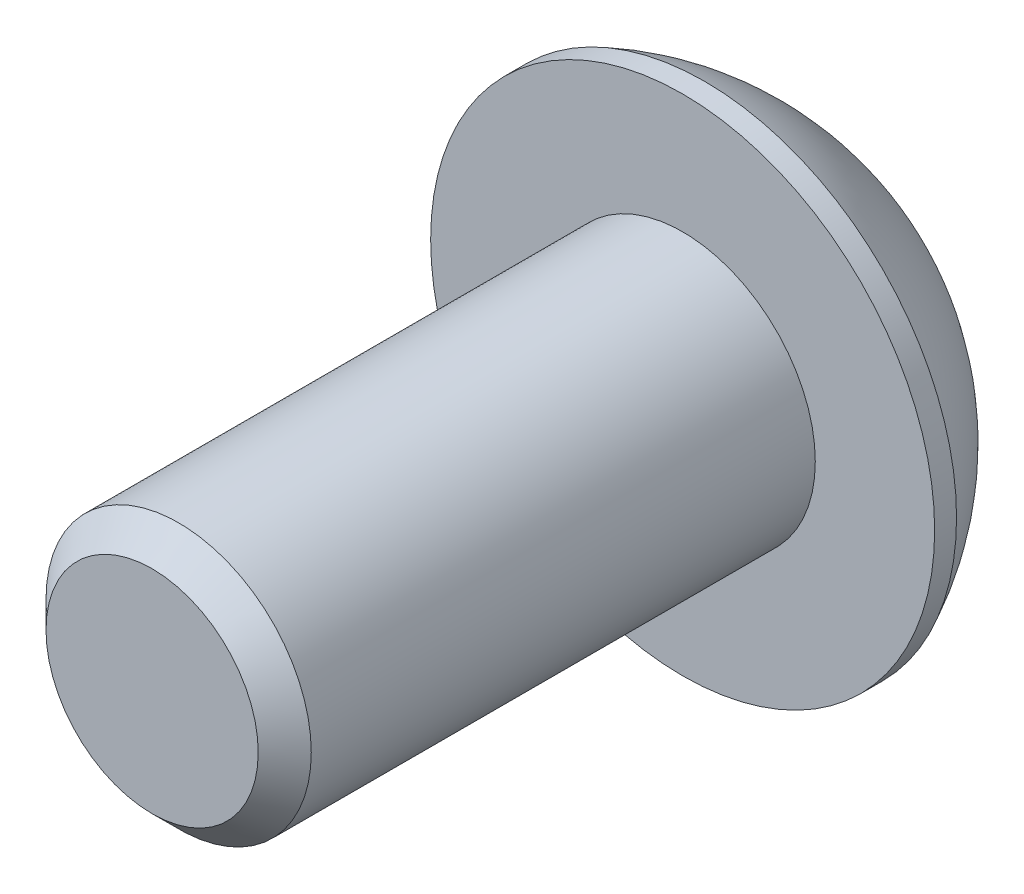
ISO-10303-21;
HEADER;
FILE_DESCRIPTION(('STEP AP214'),'2;1');
FILE_NAME('part.step','',(''),(''),'','','');
FILE_SCHEMA(('AUTOMOTIVE_DESIGN { 1 0 10303 214 1 1 1 1 }'));
ENDSEC;
DATA;
#1=APPLICATION_CONTEXT('core data for automotive mechanical design processes');
#2=APPLICATION_PROTOCOL_DEFINITION('international standard','automotive_design',2000,#1);
#3=PRODUCT_CONTEXT('',#1,'mechanical');
#4=PRODUCT('Part','Part','',(#3));
#5=PRODUCT_RELATED_PRODUCT_CATEGORY('part','',(#4));
#6=PRODUCT_DEFINITION_FORMATION('','',#4);
#7=PRODUCT_DEFINITION_CONTEXT('part definition',#1,'design');
#8=PRODUCT_DEFINITION('design','',#6,#7);
#9=PRODUCT_DEFINITION_SHAPE('','',#8);
#10=(LENGTH_UNIT() NAMED_UNIT(*) SI_UNIT(.MILLI.,.METRE.));
#11=(NAMED_UNIT(*) PLANE_ANGLE_UNIT() SI_UNIT($,.RADIAN.));
#12=(NAMED_UNIT(*) SI_UNIT($,.STERADIAN.) SOLID_ANGLE_UNIT());
#13=UNCERTAINTY_MEASURE_WITH_UNIT(LENGTH_MEASURE(1.E-05),#10,'distance_accuracy_value','');
#14=(GEOMETRIC_REPRESENTATION_CONTEXT(3) GLOBAL_UNCERTAINTY_ASSIGNED_CONTEXT((#13)) GLOBAL_UNIT_ASSIGNED_CONTEXT((#10,
#11,#12)) REPRESENTATION_CONTEXT('',''));
#15=CARTESIAN_POINT('',(0.,0.,0.));
#16=DIRECTION('',(0.,0.,1.));
#17=DIRECTION('',(1.,0.,0.));
#18=AXIS2_PLACEMENT_3D('',#15,#16,#17);
#19=CARTESIAN_POINT('',(0.,-1.15470053837925,1.155));
#20=DIRECTION('',(-0.5,-0.866025403784439,0.));
#21=DIRECTION('',(-0.866025403784439,0.5,0.));
#22=AXIS2_PLACEMENT_3D('',#19,#20,#21);
#23=PLANE('',#22);
#24=DIRECTION('',(0.,0.,-1.));
#25=VECTOR('',#24,1.);
#26=CARTESIAN_POINT('',(0.,-1.15470053837925,1.155));
#27=LINE('',#26,#25);
#28=CARTESIAN_POINT('',(0.,-1.15470053837925,1.155));
#29=VERTEX_POINT('',#28);
#30=CARTESIAN_POINT('',(0.,-1.15470053837925,0.));
#31=VERTEX_POINT('',#30);
#32=EDGE_CURVE('E11',#29,#31,#27,.T.);
#33=ORIENTED_EDGE('',*,*,#32,.T.);
#34=CARTESIAN_POINT('',(0.,-1.15470053837922,0.));
#35=CARTESIAN_POINT('',(-0.500000000000002,-0.866025403784439,0.288675134594791));
#36=CARTESIAN_POINT('',(-0.999999999999949,-0.577350269189654,0.));
#37=(BOUNDED_CURVE() B_SPLINE_CURVE(2,(#34,#35,#36),.UNSPECIFIED.,.F.,
.F.) B_SPLINE_CURVE_WITH_KNOTS((3,3),(-0.321867155116299,-0.124274873543865),
.UNSPECIFIED.) CURVE() GEOMETRIC_REPRESENTATION_ITEM() RATIONAL_B_SPLINE_CURVE((1.46410161513778,
1.69059892324148,1.46410161513778)) REPRESENTATION_ITEM(''));
#38=CARTESIAN_POINT('',(-1.,-0.577350269189626,0.));
#39=VERTEX_POINT('',#38);
#40=EDGE_CURVE('E231',#31,#39,#37,.T.);
#41=ORIENTED_EDGE('',*,*,#40,.T.);
#42=DIRECTION('',(0.,0.,-1.));
#43=VECTOR('',#42,1.);
#44=CARTESIAN_POINT('',(-1.,-0.577350269189626,1.155));
#45=LINE('',#44,#43);
#46=CARTESIAN_POINT('',(-1.,-0.577350269189626,1.155));
#47=VERTEX_POINT('',#46);
#48=EDGE_CURVE('E143',#47,#39,#45,.T.);
#49=ORIENTED_EDGE('',*,*,#48,.F.);
#50=DIRECTION('',(-0.866025403784439,0.5,0.));
#51=VECTOR('',#50,1.);
#52=CARTESIAN_POINT('',(0.,-1.15470053837925,1.155));
#53=LINE('',#52,#51);
#54=EDGE_CURVE('E200',#29,#47,#53,.T.);
#55=ORIENTED_EDGE('',*,*,#54,.F.);
#56=EDGE_LOOP('',(#33,#41,#49,#55));
#57=FACE_BOUND('',#56,.T.);
#58=ADVANCED_FACE('F17',(#57),#23,.F.);
#59=CARTESIAN_POINT('',(1.,-0.577350269189626,1.155));
#60=DIRECTION('',(0.5,-0.866025403784439,0.));
#61=DIRECTION('',(0.,0.,-1.));
#62=AXIS2_PLACEMENT_3D('',#59,#60,#61);
#63=PLANE('',#62);
#64=DIRECTION('',(0.,0.,-1.));
#65=VECTOR('',#64,1.);
#66=CARTESIAN_POINT('',(1.,-0.577350269189626,1.155));
#67=LINE('',#66,#65);
#68=CARTESIAN_POINT('',(1.,-0.577350269189626,1.155));
#69=VERTEX_POINT('',#68);
#70=CARTESIAN_POINT('',(1.,-0.577350269189626,0.));
#71=VERTEX_POINT('',#70);
#72=EDGE_CURVE('E25',#69,#71,#67,.T.);
#73=ORIENTED_EDGE('',*,*,#72,.T.);
#74=CARTESIAN_POINT('',(0.999999999999948,-0.577350269189655,0.));
#75=CARTESIAN_POINT('',(0.5,-0.866025403784439,0.288675134594789));
#76=CARTESIAN_POINT('',(0.,-1.15470053837922,0.));
#77=(BOUNDED_CURVE() B_SPLINE_CURVE(2,(#74,#75,#76),.UNSPECIFIED.,.F.,
.F.) B_SPLINE_CURVE_WITH_KNOTS((3,3),(-0.321867155116299,-0.124274873543865),
.UNSPECIFIED.) CURVE() GEOMETRIC_REPRESENTATION_ITEM() RATIONAL_B_SPLINE_CURVE((1.46410161513778,
1.69059892324148,1.46410161513778)) REPRESENTATION_ITEM(''));
#78=EDGE_CURVE('E222',#71,#31,#77,.T.);
#79=ORIENTED_EDGE('',*,*,#78,.T.);
#80=ORIENTED_EDGE('',*,*,#32,.F.);
#81=DIRECTION('',(-0.866025403784439,-0.5,0.));
#82=VECTOR('',#81,1.);
#83=CARTESIAN_POINT('',(1.,-0.577350269189626,1.155));
#84=LINE('',#83,#82);
#85=EDGE_CURVE('E146',#69,#29,#84,.T.);
#86=ORIENTED_EDGE('',*,*,#85,.F.);
#87=EDGE_LOOP('',(#73,#79,#80,#86));
#88=FACE_BOUND('',#87,.T.);
#89=ADVANCED_FACE('F263',(#88),#63,.F.);
#90=CARTESIAN_POINT('',(1.,0.577350269189626,1.155));
#91=DIRECTION('',(1.,0.,0.));
#92=DIRECTION('',(0.,0.,1.));
#93=AXIS2_PLACEMENT_3D('',#90,#91,#92);
#94=PLANE('',#93);
#95=DIRECTION('',(0.,0.,-1.));
#96=VECTOR('',#95,1.);
#97=CARTESIAN_POINT('',(1.,0.577350269189626,1.155));
#98=LINE('',#97,#96);
#99=CARTESIAN_POINT('',(1.,0.577350269189626,1.155));
#100=VERTEX_POINT('',#99);
#101=CARTESIAN_POINT('',(1.,0.577350269189626,0.));
#102=VERTEX_POINT('',#101);
#103=EDGE_CURVE('E46',#100,#102,#98,.T.);
#104=ORIENTED_EDGE('',*,*,#103,.T.);
#105=CARTESIAN_POINT('',(1.,0.577350269189569,0.));
#106=CARTESIAN_POINT('',(1.,0.,0.288675134594791));
#107=CARTESIAN_POINT('',(1.,-0.577350269189568,0.));
#108=(BOUNDED_CURVE() B_SPLINE_CURVE(2,(#105,#106,#107),.UNSPECIFIED.,.F.,
.F.) B_SPLINE_CURVE_WITH_KNOTS((3,3),(-0.3218671551163,-0.124274873543865),
.UNSPECIFIED.) CURVE() GEOMETRIC_REPRESENTATION_ITEM() RATIONAL_B_SPLINE_CURVE((1.46410161513777,
1.69059892324148,1.46410161513777)) REPRESENTATION_ITEM(''));
#109=EDGE_CURVE('E214',#102,#71,#108,.T.);
#110=ORIENTED_EDGE('',*,*,#109,.T.);
#111=ORIENTED_EDGE('',*,*,#72,.F.);
#112=DIRECTION('',(0.,-1.,0.));
#113=VECTOR('',#112,1.);
#114=CARTESIAN_POINT('',(1.,0.577350269189626,1.155));
#115=LINE('',#114,#113);
#116=EDGE_CURVE('E191',#100,#69,#115,.T.);
#117=ORIENTED_EDGE('',*,*,#116,.F.);
#118=EDGE_LOOP('',(#104,#110,#111,#117));
#119=FACE_BOUND('',#118,.T.);
#120=ADVANCED_FACE('F269',(#119),#94,.F.);
#121=CARTESIAN_POINT('',(0.,1.15470053837925,1.155));
#122=DIRECTION('',(0.5,0.866025403784439,0.));
#123=DIRECTION('',(0.,0.,-1.));
#124=AXIS2_PLACEMENT_3D('',#121,#122,#123);
#125=PLANE('',#124);
#126=DIRECTION('',(0.,0.,-1.));
#127=VECTOR('',#126,1.);
#128=CARTESIAN_POINT('',(0.,1.15470053837925,1.155));
#129=LINE('',#128,#127);
#130=CARTESIAN_POINT('',(0.,1.15470053837925,1.155));
#131=VERTEX_POINT('',#130);
#132=CARTESIAN_POINT('',(0.,1.15470053837925,0.));
#133=VERTEX_POINT('',#132);
#134=EDGE_CURVE('E166',#131,#133,#129,.T.);
#135=ORIENTED_EDGE('',*,*,#134,.T.);
#136=CARTESIAN_POINT('',(0.,1.15470053837922,0.));
#137=CARTESIAN_POINT('',(0.5,0.866025403784439,0.288675134594791));
#138=CARTESIAN_POINT('',(0.999999999999951,0.577350269189654,0.));
#139=(BOUNDED_CURVE() B_SPLINE_CURVE(2,(#136,#137,#138),.UNSPECIFIED.,.F.,
.F.) B_SPLINE_CURVE_WITH_KNOTS((3,3),(-0.3218671551163,-0.124274873543865),
.UNSPECIFIED.) CURVE() GEOMETRIC_REPRESENTATION_ITEM() RATIONAL_B_SPLINE_CURVE((1.46410161513778,
1.69059892324148,1.46410161513778)) REPRESENTATION_ITEM(''));
#140=EDGE_CURVE('E206',#133,#102,#139,.T.);
#141=ORIENTED_EDGE('',*,*,#140,.T.);
#142=ORIENTED_EDGE('',*,*,#103,.F.);
#143=DIRECTION('',(0.866025403784439,-0.5,0.));
#144=VECTOR('',#143,1.);
#145=CARTESIAN_POINT('',(0.,1.15470053837925,1.155));
#146=LINE('',#145,#144);
#147=EDGE_CURVE('E249',#131,#100,#146,.T.);
#148=ORIENTED_EDGE('',*,*,#147,.F.);
#149=EDGE_LOOP('',(#135,#141,#142,#148));
#150=FACE_BOUND('',#149,.T.);
#151=ADVANCED_FACE('F310',(#150),#125,.F.);
#152=CARTESIAN_POINT('',(-1.,0.577350269189626,1.155));
#153=DIRECTION('',(-0.5,0.866025403784439,0.));
#154=DIRECTION('',(0.,0.,1.));
#155=AXIS2_PLACEMENT_3D('',#152,#153,#154);
#156=PLANE('',#155);
#157=DIRECTION('',(0.,0.,-1.));
#158=VECTOR('',#157,1.);
#159=CARTESIAN_POINT('',(-1.,0.577350269189626,1.155));
#160=LINE('',#159,#158);
#161=CARTESIAN_POINT('',(-1.,0.577350269189626,1.155));
#162=VERTEX_POINT('',#161);
#163=CARTESIAN_POINT('',(-1.,0.577350269189626,0.));
#164=VERTEX_POINT('',#163);
#165=EDGE_CURVE('E145',#162,#164,#160,.T.);
#166=ORIENTED_EDGE('',*,*,#165,.T.);
#167=CARTESIAN_POINT('',(-0.999999999999952,0.577350269189653,0.));
#168=CARTESIAN_POINT('',(-0.5,0.866025403784439,0.288675134594791));
#169=CARTESIAN_POINT('',(0.,1.15470053837922,0.));
#170=(BOUNDED_CURVE() B_SPLINE_CURVE(2,(#167,#168,#169),.UNSPECIFIED.,.F.,
.F.) B_SPLINE_CURVE_WITH_KNOTS((3,3),(-0.3218671551163,-0.124274873543865),
.UNSPECIFIED.) CURVE() GEOMETRIC_REPRESENTATION_ITEM() RATIONAL_B_SPLINE_CURVE((1.46410161513778,
1.69059892324148,1.46410161513778)) REPRESENTATION_ITEM(''));
#171=EDGE_CURVE('E152',#164,#133,#170,.T.);
#172=ORIENTED_EDGE('',*,*,#171,.T.);
#173=ORIENTED_EDGE('',*,*,#134,.F.);
#174=DIRECTION('',(0.866025403784439,0.5,0.));
#175=VECTOR('',#174,1.);
#176=CARTESIAN_POINT('',(-1.,0.577350269189626,1.155));
#177=LINE('',#176,#175);
#178=EDGE_CURVE('E199',#162,#131,#177,.T.);
#179=ORIENTED_EDGE('',*,*,#178,.F.);
#180=EDGE_LOOP('',(#166,#172,#173,#179));
#181=FACE_BOUND('',#180,.T.);
#182=ADVANCED_FACE('F315',(#181),#156,.F.);
#183=CARTESIAN_POINT('',(-1.,-0.577350269189626,1.155));
#184=DIRECTION('',(-1.,0.,0.));
#185=DIRECTION('',(0.,0.,1.));
#186=AXIS2_PLACEMENT_3D('',#183,#184,#185);
#187=PLANE('',#186);
#188=ORIENTED_EDGE('',*,*,#48,.T.);
#189=CARTESIAN_POINT('',(-1.,-0.577350269189568,0.));
#190=CARTESIAN_POINT('',(-1.,0.,0.288675134594789));
#191=CARTESIAN_POINT('',(-1.,0.577350269189568,0.));
#192=(BOUNDED_CURVE() B_SPLINE_CURVE(2,(#189,#190,#191),.UNSPECIFIED.,.F.,
.F.) B_SPLINE_CURVE_WITH_KNOTS((3,3),(-0.321867155116299,-0.124274873543865),
.UNSPECIFIED.) CURVE() GEOMETRIC_REPRESENTATION_ITEM() RATIONAL_B_SPLINE_CURVE((1.46410161513777,
1.69059892324148,1.46410161513777)) REPRESENTATION_ITEM(''));
#193=EDGE_CURVE('E142',#39,#164,#192,.T.);
#194=ORIENTED_EDGE('',*,*,#193,.T.);
#195=ORIENTED_EDGE('',*,*,#165,.F.);
#196=DIRECTION('',(0.,1.,0.));
#197=VECTOR('',#196,1.);
#198=CARTESIAN_POINT('',(-1.,-0.577350269189626,1.155));
#199=LINE('',#198,#197);
#200=EDGE_CURVE('E195',#47,#162,#199,.T.);
#201=ORIENTED_EDGE('',*,*,#200,.F.);
#202=EDGE_LOOP('',(#188,#194,#195,#201));
#203=FACE_BOUND('',#202,.T.);
#204=ADVANCED_FACE('F305',(#203),#187,.F.);
#205=CARTESIAN_POINT('',(-1.,-0.577350269189625,1.155));
#206=DIRECTION('',(0.,0.,-1.));
#207=DIRECTION('',(0.,-1.,0.));
#208=AXIS2_PLACEMENT_3D('',#205,#206,#207);
#209=PLANE('',#208);
#210=ORIENTED_EDGE('',*,*,#54,.T.);
#211=ORIENTED_EDGE('',*,*,#200,.T.);
#212=ORIENTED_EDGE('',*,*,#178,.T.);
#213=ORIENTED_EDGE('',*,*,#147,.T.);
#214=ORIENTED_EDGE('',*,*,#116,.T.);
#215=ORIENTED_EDGE('',*,*,#85,.T.);
#216=EDGE_LOOP('',(#210,#211,#212,#213,#214,#215));
#217=FACE_BOUND('',#216,.T.);
#218=ADVANCED_FACE('F309',(#217),#209,.T.);
#219=CARTESIAN_POINT('',(0.,0.,0.));
#220=DIRECTION('',(0.,0.,-1.));
#221=DIRECTION('',(-1.,0.,0.));
#222=AXIS2_PLACEMENT_3D('',#219,#220,#221);
#223=CONICAL_SURFACE('',#222,1.15470053837925,0.78539816339745);
#224=CARTESIAN_POINT('',(0.,0.,0.));
#225=DIRECTION('',(0.,0.,-1.));
#226=DIRECTION('',(-1.,0.,0.));
#227=AXIS2_PLACEMENT_3D('',#224,#225,#226);
#228=CIRCLE('',#227,1.15470053837925);
#229=EDGE_CURVE('E153',#31,#39,#228,.T.);
#230=ORIENTED_EDGE('',*,*,#229,.T.);
#231=ORIENTED_EDGE('',*,*,#40,.F.);
#232=EDGE_LOOP('',(#230,#231));
#233=FACE_BOUND('',#232,.T.);
#234=ADVANCED_FACE('F289',(#233),#223,.F.);
#235=CARTESIAN_POINT('',(0.,0.,0.));
#236=DIRECTION('',(0.,0.,-1.));
#237=DIRECTION('',(-1.,0.,0.));
#238=AXIS2_PLACEMENT_3D('',#235,#236,#237);
#239=CONICAL_SURFACE('',#238,1.15470053837925,0.78539816339745);
#240=CARTESIAN_POINT('',(0.,0.,0.));
#241=DIRECTION('',(0.,0.,-1.));
#242=DIRECTION('',(-1.,0.,0.));
#243=AXIS2_PLACEMENT_3D('',#240,#241,#242);
#244=CIRCLE('',#243,1.15470053837925);
#245=EDGE_CURVE('E148',#71,#31,#244,.T.);
#246=ORIENTED_EDGE('',*,*,#245,.T.);
#247=ORIENTED_EDGE('',*,*,#78,.F.);
#248=EDGE_LOOP('',(#246,#247));
#249=FACE_BOUND('',#248,.T.);
#250=ADVANCED_FACE('F265',(#249),#239,.F.);
#251=CARTESIAN_POINT('',(0.,0.,0.));
#252=DIRECTION('',(0.,0.,-1.));
#253=DIRECTION('',(1.,0.,0.));
#254=AXIS2_PLACEMENT_3D('',#251,#252,#253);
#255=CONICAL_SURFACE('',#254,1.15470053837925,0.78539816339745);
#256=CARTESIAN_POINT('',(0.,0.,0.));
#257=DIRECTION('',(0.,0.,-1.));
#258=DIRECTION('',(-1.,0.,0.));
#259=AXIS2_PLACEMENT_3D('',#256,#257,#258);
#260=CIRCLE('',#259,1.15470053837925);
#261=EDGE_CURVE('E184',#102,#71,#260,.T.);
#262=ORIENTED_EDGE('',*,*,#261,.T.);
#263=ORIENTED_EDGE('',*,*,#109,.F.);
#264=EDGE_LOOP('',(#262,#263));
#265=FACE_BOUND('',#264,.T.);
#266=ADVANCED_FACE('F277',(#265),#255,.F.);
#267=CARTESIAN_POINT('',(0.,0.,0.));
#268=DIRECTION('',(0.,0.,-1.));
#269=DIRECTION('',(-1.,0.,0.));
#270=AXIS2_PLACEMENT_3D('',#267,#268,#269);
#271=CONICAL_SURFACE('',#270,1.15470053837925,0.78539816339745);
#272=CARTESIAN_POINT('',(0.,0.,0.));
#273=DIRECTION('',(0.,0.,-1.));
#274=DIRECTION('',(-1.,0.,0.));
#275=AXIS2_PLACEMENT_3D('',#272,#273,#274);
#276=CIRCLE('',#275,1.15470053837925);
#277=EDGE_CURVE('E135',#133,#102,#276,.T.);
#278=ORIENTED_EDGE('',*,*,#277,.T.);
#279=ORIENTED_EDGE('',*,*,#140,.F.);
#280=EDGE_LOOP('',(#278,#279));
#281=FACE_BOUND('',#280,.T.);
#282=ADVANCED_FACE('F279',(#281),#271,.F.);
#283=CARTESIAN_POINT('',(0.,0.,0.));
#284=DIRECTION('',(0.,0.,-1.));
#285=DIRECTION('',(-1.,0.,0.));
#286=AXIS2_PLACEMENT_3D('',#283,#284,#285);
#287=CONICAL_SURFACE('',#286,1.15470053837925,0.78539816339745);
#288=CARTESIAN_POINT('',(0.,0.,0.));
#289=DIRECTION('',(0.,0.,-1.));
#290=DIRECTION('',(-1.,0.,0.));
#291=AXIS2_PLACEMENT_3D('',#288,#289,#290);
#292=CIRCLE('',#291,1.15470053837925);
#293=EDGE_CURVE('E181',#164,#133,#292,.T.);
#294=ORIENTED_EDGE('',*,*,#293,.T.);
#295=ORIENTED_EDGE('',*,*,#171,.F.);
#296=EDGE_LOOP('',(#294,#295));
#297=FACE_BOUND('',#296,.T.);
#298=ADVANCED_FACE('F286',(#297),#287,.F.);
#299=CARTESIAN_POINT('',(0.,-2.85,1.65));
#300=DIRECTION('',(0.,0.,-1.));
#301=DIRECTION('',(0.,-1.,0.));
#302=AXIS2_PLACEMENT_3D('',#299,#300,#301);
#303=PLANE('',#302);
#304=CARTESIAN_POINT('',(0.,0.,1.65));
#305=DIRECTION('',(0.,0.,-1.));
#306=DIRECTION('',(-1.,0.,0.));
#307=AXIS2_PLACEMENT_3D('',#304,#305,#306);
#308=CIRCLE('',#307,1.5);
#309=CARTESIAN_POINT('',(1.5,0.,1.65));
#310=VERTEX_POINT('',#309);
#311=EDGE_CURVE('E117',#310,#310,#308,.T.);
#312=ORIENTED_EDGE('',*,*,#311,.T.);
#313=EDGE_LOOP('',(#312));
#314=FACE_BOUND('',#313,.T.);
#315=CARTESIAN_POINT('',(0.,0.,1.65));
#316=DIRECTION('',(0.,0.,-1.));
#317=DIRECTION('',(-1.,0.,0.));
#318=AXIS2_PLACEMENT_3D('',#315,#316,#317);
#319=CIRCLE('',#318,2.85);
#320=CARTESIAN_POINT('',(2.85,0.,1.65));
#321=VERTEX_POINT('',#320);
#322=EDGE_CURVE('E156',#321,#321,#319,.T.);
#323=ORIENTED_EDGE('',*,*,#322,.F.);
#324=EDGE_LOOP('',(#323));
#325=FACE_BOUND('',#324,.T.);
#326=ADVANCED_FACE('F322',(#314,#325),#303,.F.);
#327=CARTESIAN_POINT('',(0.,-1.5,0.));
#328=DIRECTION('',(0.,0.,1.));
#329=DIRECTION('',(1.,0.,0.));
#330=AXIS2_PLACEMENT_3D('',#327,#328,#329);
#331=PLANE('',#330);
#332=ORIENTED_EDGE('',*,*,#261,.F.);
#333=ORIENTED_EDGE('',*,*,#277,.F.);
#334=ORIENTED_EDGE('',*,*,#293,.F.);
#335=CARTESIAN_POINT('',(0.,0.,0.));
#336=DIRECTION('',(0.,0.,-1.));
#337=DIRECTION('',(-1.,0.,0.));
#338=AXIS2_PLACEMENT_3D('',#335,#336,#337);
#339=CIRCLE('',#338,1.15470053837925);
#340=EDGE_CURVE('E137',#39,#164,#339,.T.);
#341=ORIENTED_EDGE('',*,*,#340,.F.);
#342=ORIENTED_EDGE('',*,*,#229,.F.);
#343=ORIENTED_EDGE('',*,*,#245,.F.);
#344=EDGE_LOOP('',(#332,#333,#334,#341,#342,#343));
#345=FACE_BOUND('',#344,.T.);
#346=CARTESIAN_POINT('',(0.,0.,0.));
#347=DIRECTION('',(0.,0.,-1.));
#348=DIRECTION('',(-1.,0.,0.));
#349=AXIS2_PLACEMENT_3D('',#346,#347,#348);
#350=CIRCLE('',#349,1.5);
#351=CARTESIAN_POINT('',(0.,-1.5,0.));
#352=VERTEX_POINT('',#351);
#353=EDGE_CURVE('E159',#352,#352,#350,.T.);
#354=ORIENTED_EDGE('',*,*,#353,.T.);
#355=EDGE_LOOP('',(#354));
#356=FACE_BOUND('',#355,.T.);
#357=ADVANCED_FACE('F273',(#345,#356),#331,.F.);
#358=CARTESIAN_POINT('',(0.,0.,2.79483288770053));
#359=DIRECTION('',(-1.,0.,0.));
#360=DIRECTION('',(0.,-1.,0.));
#361=AXIS2_PLACEMENT_3D('',#358,#359,#360);
#362=SPHERICAL_SURFACE('',#361,3.17192226735973);
#363=CARTESIAN_POINT('',(0.,0.,2.79483288770053));
#364=DIRECTION('',(0.,0.,-1.));
#365=DIRECTION('',(-1.,0.,0.));
#366=AXIS2_PLACEMENT_3D('',#363,#364,#365);
#367=SPHERICAL_SURFACE('',#366,3.17192226735973);
#368=ORIENTED_EDGE('',*,*,#353,.F.);
#369=EDGE_LOOP('',(#368));
#370=FACE_BOUND('',#369,.T.);
#371=CARTESIAN_POINT('',(0.,0.,1.4025));
#372=DIRECTION('',(0.,0.,-1.));
#373=DIRECTION('',(-1.,0.,0.));
#374=AXIS2_PLACEMENT_3D('',#371,#372,#373);
#375=CIRCLE('',#374,2.85);
#376=CARTESIAN_POINT('',(2.85,0.,1.4025));
#377=VERTEX_POINT('',#376);
#378=EDGE_CURVE('E141',#377,#377,#375,.T.);
#379=ORIENTED_EDGE('',*,*,#378,.T.);
#380=EDGE_LOOP('',(#379));
#381=FACE_BOUND('',#380,.T.);
#382=ADVANCED_FACE('F330',(#370,#381),#367,.T.);
#383=CARTESIAN_POINT('',(0.,0.,0.));
#384=DIRECTION('',(0.,0.,-1.));
#385=DIRECTION('',(-1.,0.,0.));
#386=AXIS2_PLACEMENT_3D('',#383,#384,#385);
#387=CYLINDRICAL_SURFACE('',#386,2.85);
#388=ORIENTED_EDGE('',*,*,#378,.F.);
#389=DIRECTION('',(0.,0.,1.));
#390=VECTOR('',#389,1.);
#391=CARTESIAN_POINT('',(2.85,0.,0.));
#392=LINE('',#391,#390);
#393=EDGE_CURVE('E160',#377,#321,#392,.T.);
#394=ORIENTED_EDGE('',*,*,#393,.T.);
#395=ORIENTED_EDGE('',*,*,#322,.T.);
#396=ORIENTED_EDGE('',*,*,#393,.F.);
#397=EDGE_LOOP('',(#388,#394,#395,#396));
#398=FACE_BOUND('',#397,.T.);
#399=ADVANCED_FACE('F332',(#398),#387,.T.);
#400=CARTESIAN_POINT('',(0.,0.,0.));
#401=DIRECTION('',(0.,0.,-1.));
#402=DIRECTION('',(-1.,0.,0.));
#403=AXIS2_PLACEMENT_3D('',#400,#401,#402);
#404=CONICAL_SURFACE('',#403,1.15470053837925,0.78539816339745);
#405=ORIENTED_EDGE('',*,*,#193,.F.);
#406=ORIENTED_EDGE('',*,*,#340,.T.);
#407=EDGE_LOOP('',(#405,#406));
#408=FACE_BOUND('',#407,.T.);
#409=ADVANCED_FACE('F303',(#408),#404,.F.);
#410=CARTESIAN_POINT('',(0.,0.,7.65));
#411=DIRECTION('',(0.,0.,1.));
#412=DIRECTION('',(1.,0.,0.));
#413=AXIS2_PLACEMENT_3D('',#410,#411,#412);
#414=PLANE('',#413);
#415=CARTESIAN_POINT('',(0.,0.,7.65));
#416=DIRECTION('',(0.,0.,-1.));
#417=DIRECTION('',(-1.,0.,0.));
#418=AXIS2_PLACEMENT_3D('',#415,#416,#417);
#419=CIRCLE('',#418,1.2);
#420=CARTESIAN_POINT('',(1.2,0.,7.65));
#421=VERTEX_POINT('',#420);
#422=EDGE_CURVE('E119',#421,#421,#419,.T.);
#423=ORIENTED_EDGE('',*,*,#422,.F.);
#424=EDGE_LOOP('',(#423));
#425=FACE_BOUND('',#424,.T.);
#426=ADVANCED_FACE('F337',(#425),#414,.T.);
#427=CARTESIAN_POINT('',(0.,0.,1.65));
#428=DIRECTION('',(0.,0.,1.));
#429=DIRECTION('',(-1.,0.,0.));
#430=AXIS2_PLACEMENT_3D('',#427,#428,#429);
#431=CYLINDRICAL_SURFACE('',#430,1.5);
#432=CARTESIAN_POINT('',(0.,0.,7.35));
#433=DIRECTION('',(0.,0.,1.));
#434=DIRECTION('',(-1.,0.,0.));
#435=AXIS2_PLACEMENT_3D('',#432,#433,#434);
#436=CIRCLE('',#435,1.5);
#437=CARTESIAN_POINT('',(1.5,0.,7.35));
#438=VERTEX_POINT('',#437);
#439=EDGE_CURVE('E116',#438,#438,#436,.T.);
#440=ORIENTED_EDGE('',*,*,#439,.F.);
#441=DIRECTION('',(0.,0.,-1.));
#442=VECTOR('',#441,1.);
#443=CARTESIAN_POINT('',(1.5,0.,1.65));
#444=LINE('',#443,#442);
#445=EDGE_CURVE('E112',#438,#310,#444,.T.);
#446=ORIENTED_EDGE('',*,*,#445,.T.);
#447=ORIENTED_EDGE('',*,*,#311,.F.);
#448=ORIENTED_EDGE('',*,*,#445,.F.);
#449=EDGE_LOOP('',(#440,#446,#447,#448));
#450=FACE_BOUND('',#449,.T.);
#451=ADVANCED_FACE('F114',(#450),#431,.T.);
#452=CARTESIAN_POINT('',(0.,0.,7.5));
#453=DIRECTION('',(0.,0.,-1.));
#454=DIRECTION('',(-1.,0.,0.));
#455=AXIS2_PLACEMENT_3D('',#452,#453,#454);
#456=CONICAL_SURFACE('',#455,1.35,0.785398163397448);
#457=ORIENTED_EDGE('',*,*,#439,.T.);
#458=DIRECTION('',(-0.707106781186547,0.,0.707106781186548));
#459=VECTOR('',#458,1.);
#460=CARTESIAN_POINT('',(1.35,0.,7.5));
#461=LINE('',#460,#459);
#462=EDGE_CURVE('E123',#438,#421,#461,.T.);
#463=ORIENTED_EDGE('',*,*,#462,.T.);
#464=ORIENTED_EDGE('',*,*,#422,.T.);
#465=ORIENTED_EDGE('',*,*,#462,.F.);
#466=EDGE_LOOP('',(#457,#463,#464,#465));
#467=FACE_BOUND('',#466,.T.);
#468=ADVANCED_FACE('F124',(#467),#456,.T.);
#469=CLOSED_SHELL('',(#58,#89,#120,#151,#182,#204,#218,#234,#250,#266,#282,#298,#326,#357,#382,
#399,#409,#426,#451,#468));
#470=MANIFOLD_SOLID_BREP('B1',#469);
#471=ADVANCED_BREP_SHAPE_REPRESENTATION('',(#18,#470),#14);
#472=SHAPE_DEFINITION_REPRESENTATION(#9,#471);
ENDSEC;
END-ISO-10303-21;
